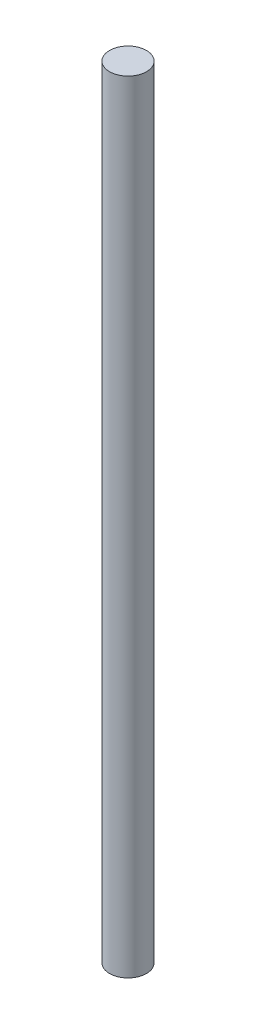
ISO-10303-21;
HEADER;
FILE_DESCRIPTION(('STEP AP214'),'2;1');
FILE_NAME('part.step','',(''),(''),'','','');
FILE_SCHEMA(('AUTOMOTIVE_DESIGN { 1 0 10303 214 1 1 1 1 }'));
ENDSEC;
DATA;
#1=APPLICATION_CONTEXT('core data for automotive mechanical design processes');
#2=APPLICATION_PROTOCOL_DEFINITION('international standard','automotive_design',2000,#1);
#3=PRODUCT_CONTEXT('',#1,'mechanical');
#4=PRODUCT('Part','Part','',(#3));
#5=PRODUCT_RELATED_PRODUCT_CATEGORY('part','',(#4));
#6=PRODUCT_DEFINITION_FORMATION('','',#4);
#7=PRODUCT_DEFINITION_CONTEXT('part definition',#1,'design');
#8=PRODUCT_DEFINITION('design','',#6,#7);
#9=PRODUCT_DEFINITION_SHAPE('','',#8);
#10=(LENGTH_UNIT() NAMED_UNIT(*) SI_UNIT(.MILLI.,.METRE.));
#11=(NAMED_UNIT(*) PLANE_ANGLE_UNIT() SI_UNIT($,.RADIAN.));
#12=(NAMED_UNIT(*) SI_UNIT($,.STERADIAN.) SOLID_ANGLE_UNIT());
#13=UNCERTAINTY_MEASURE_WITH_UNIT(LENGTH_MEASURE(1.E-05),#10,'distance_accuracy_value','');
#14=(GEOMETRIC_REPRESENTATION_CONTEXT(3) GLOBAL_UNCERTAINTY_ASSIGNED_CONTEXT((#13)) GLOBAL_UNIT_ASSIGNED_CONTEXT((#10,
#11,#12)) REPRESENTATION_CONTEXT('',''));
#15=CARTESIAN_POINT('',(0.,0.,0.));
#16=DIRECTION('',(0.,0.,1.));
#17=DIRECTION('',(1.,0.,0.));
#18=AXIS2_PLACEMENT_3D('',#15,#16,#17);
#19=CARTESIAN_POINT('',(0.,635.,0.));
#20=DIRECTION('',(0.,-1.,0.));
#21=DIRECTION('',(0.,0.,-1.));
#22=AXIS2_PLACEMENT_3D('',#19,#20,#21);
#23=CYLINDRICAL_SURFACE('',#22,15.);
#24=CARTESIAN_POINT('',(0.,635.,0.));
#25=DIRECTION('',(0.,1.,0.));
#26=DIRECTION('',(0.,0.,1.));
#27=AXIS2_PLACEMENT_3D('',#24,#25,#26);
#28=CIRCLE('',#27,15.);
#29=CARTESIAN_POINT('',(0.,635.,-15.));
#30=VERTEX_POINT('',#29);
#31=EDGE_CURVE('E10',#30,#30,#28,.T.);
#32=CARTESIAN_POINT('',(0.,0.,0.));
#33=DIRECTION('',(0.,1.,0.));
#34=DIRECTION('',(0.,0.,1.));
#35=AXIS2_PLACEMENT_3D('',#32,#33,#34);
#36=CIRCLE('',#35,15.);
#37=CARTESIAN_POINT('',(0.,-1.11022302462516E-13,-15.));
#38=VERTEX_POINT('',#37);
#39=EDGE_CURVE('E40',#38,#38,#36,.T.);
#40=CARTESIAN_POINT('',(0.,635.,-15.));
#41=CARTESIAN_POINT('',(0.,628.385416666667,-15.));
#42=CARTESIAN_POINT('',(0.,621.770833333333,-15.));
#43=CARTESIAN_POINT('',(0.,608.541666666667,-15.));
#44=CARTESIAN_POINT('',(0.,601.927083333333,-15.));
#45=CARTESIAN_POINT('',(0.,588.697916666667,-15.));
#46=CARTESIAN_POINT('',(0.,582.083333333333,-15.));
#47=CARTESIAN_POINT('',(0.,568.854166666667,-15.));
#48=CARTESIAN_POINT('',(0.,562.239583333333,-15.));
#49=CARTESIAN_POINT('',(0.,549.010416666667,-15.));
#50=CARTESIAN_POINT('',(0.,542.395833333333,-15.));
#51=CARTESIAN_POINT('',(0.,529.166666666667,-15.));
#52=CARTESIAN_POINT('',(0.,522.552083333333,-15.));
#53=CARTESIAN_POINT('',(0.,509.322916666667,-15.));
#54=CARTESIAN_POINT('',(0.,502.708333333333,-15.));
#55=CARTESIAN_POINT('',(0.,489.479166666667,-15.));
#56=CARTESIAN_POINT('',(0.,482.864583333333,-15.));
#57=CARTESIAN_POINT('',(0.,469.635416666667,-15.));
#58=CARTESIAN_POINT('',(0.,463.020833333333,-15.));
#59=CARTESIAN_POINT('',(0.,449.791666666667,-15.));
#60=CARTESIAN_POINT('',(0.,443.177083333333,-15.));
#61=CARTESIAN_POINT('',(0.,429.947916666667,-15.));
#62=CARTESIAN_POINT('',(0.,423.333333333333,-15.));
#63=CARTESIAN_POINT('',(0.,410.104166666667,-15.));
#64=CARTESIAN_POINT('',(0.,403.489583333333,-15.));
#65=CARTESIAN_POINT('',(0.,390.260416666667,-15.));
#66=CARTESIAN_POINT('',(0.,383.645833333333,-15.));
#67=CARTESIAN_POINT('',(0.,370.416666666667,-15.));
#68=CARTESIAN_POINT('',(0.,363.802083333333,-15.));
#69=CARTESIAN_POINT('',(0.,350.572916666667,-15.));
#70=CARTESIAN_POINT('',(0.,343.958333333333,-15.));
#71=CARTESIAN_POINT('',(0.,330.729166666667,-15.));
#72=CARTESIAN_POINT('',(0.,324.114583333333,-15.));
#73=CARTESIAN_POINT('',(0.,310.885416666667,-15.));
#74=CARTESIAN_POINT('',(0.,304.270833333333,-15.));
#75=CARTESIAN_POINT('',(0.,291.041666666667,-15.));
#76=CARTESIAN_POINT('',(0.,284.427083333333,-15.));
#77=CARTESIAN_POINT('',(0.,271.197916666667,-15.));
#78=CARTESIAN_POINT('',(0.,264.583333333333,-15.));
#79=CARTESIAN_POINT('',(0.,251.354166666667,-15.));
#80=CARTESIAN_POINT('',(0.,244.739583333333,-15.));
#81=CARTESIAN_POINT('',(0.,231.510416666667,-15.));
#82=CARTESIAN_POINT('',(0.,224.895833333333,-15.));
#83=CARTESIAN_POINT('',(0.,211.666666666667,-15.));
#84=CARTESIAN_POINT('',(0.,205.052083333333,-15.));
#85=CARTESIAN_POINT('',(0.,191.822916666667,-15.));
#86=CARTESIAN_POINT('',(0.,185.208333333333,-15.));
#87=CARTESIAN_POINT('',(0.,171.979166666667,-15.));
#88=CARTESIAN_POINT('',(0.,165.364583333333,-15.));
#89=CARTESIAN_POINT('',(0.,152.135416666667,-15.));
#90=CARTESIAN_POINT('',(0.,145.520833333333,-15.));
#91=CARTESIAN_POINT('',(0.,132.291666666667,-15.));
#92=CARTESIAN_POINT('',(0.,125.677083333333,-15.));
#93=CARTESIAN_POINT('',(0.,112.447916666667,-15.));
#94=CARTESIAN_POINT('',(0.,105.833333333333,-15.));
#95=CARTESIAN_POINT('',(0.,92.6041666666666,-15.));
#96=CARTESIAN_POINT('',(0.,85.9895833333332,-15.));
#97=CARTESIAN_POINT('',(0.,72.7604166666665,-15.));
#98=CARTESIAN_POINT('',(0.,66.1458333333332,-15.));
#99=CARTESIAN_POINT('',(0.,52.9166666666666,-15.));
#100=CARTESIAN_POINT('',(0.,46.3020833333332,-15.));
#101=CARTESIAN_POINT('',(0.,33.0729166666666,-15.));
#102=CARTESIAN_POINT('',(0.,26.4583333333333,-15.));
#103=CARTESIAN_POINT('',(0.,13.2291666666666,-15.));
#104=CARTESIAN_POINT('',(0.,6.61458333333324,-15.));
#105=CARTESIAN_POINT('',(0.,-1.11022302462516E-13,-15.));
#106=B_SPLINE_CURVE_WITH_KNOTS('',3,(#40,#41,#42,#43,#44,#45,#46,#47,#48,#49,#50,#51,#52,#53,
#54,#55,#56,#57,#58,#59,#60,#61,#62,#63,#64,#65,#66,#67,#68,#69,#70,#71,#72,#73,#74,#75,#76,#77,
#78,#79,#80,#81,#82,#83,#84,#85,#86,#87,#88,#89,#90,#91,#92,#93,#94,#95,#96,#97,#98,#99,#100,
#101,#102,#103,#104,#105),.UNSPECIFIED.,.F.,.F.,(4,2,2,2,2,2,2,2,2,2,2,2,2,2,2,2,2,2,2,2,2,2,2,
2,2,2,2,2,2,2,2,2,4),(0.,19.8437499999999,39.6875,59.5312499999999,79.375,99.2187499999999,
119.0625,138.90625,158.75,178.59375,198.4375,218.28125,238.125,257.96875,277.8125,297.65625,
317.5,337.34375,357.1875,377.03125,396.875,416.71875,436.5625,456.40625,476.25,496.09375,
515.9375,535.78125,555.625,575.46875,595.3125,615.15625,635.),.UNSPECIFIED.);
#107=EDGE_CURVE('BSEAM37',#30,#38,#106,.T.);
#108=ORIENTED_EDGE('',*,*,#31,.F.);
#109=ORIENTED_EDGE('',*,*,#39,.T.);
#110=ORIENTED_EDGE('',*,*,#107,.T.);
#111=ORIENTED_EDGE('',*,*,#107,.F.);
#112=EDGE_LOOP('',(#108,#110,#109,#111));
#113=FACE_BOUND('',#112,.T.);
#114=ADVANCED_FACE('F37',(#113),#23,.T.);
#115=CARTESIAN_POINT('',(0.,635.,0.));
#116=DIRECTION('',(0.,1.,0.));
#117=DIRECTION('',(0.,0.,1.));
#118=AXIS2_PLACEMENT_3D('',#115,#116,#117);
#119=PLANE('',#118);
#120=ORIENTED_EDGE('',*,*,#31,.T.);
#121=EDGE_LOOP('',(#120));
#122=FACE_BOUND('',#121,.T.);
#123=ADVANCED_FACE('F52',(#122),#119,.T.);
#124=CARTESIAN_POINT('',(0.,0.,0.));
#125=DIRECTION('',(0.,1.,0.));
#126=DIRECTION('',(0.,0.,1.));
#127=AXIS2_PLACEMENT_3D('',#124,#125,#126);
#128=PLANE('',#127);
#129=ORIENTED_EDGE('',*,*,#39,.F.);
#130=EDGE_LOOP('',(#129));
#131=FACE_BOUND('',#130,.T.);
#132=ADVANCED_FACE('F50',(#131),#128,.F.);
#133=CLOSED_SHELL('',(#114,#123,#132));
#134=MANIFOLD_SOLID_BREP('B2',#133);
#135=ADVANCED_BREP_SHAPE_REPRESENTATION('',(#18,#134),#14);
#136=SHAPE_DEFINITION_REPRESENTATION(#9,#135);
ENDSEC;
END-ISO-10303-21;
